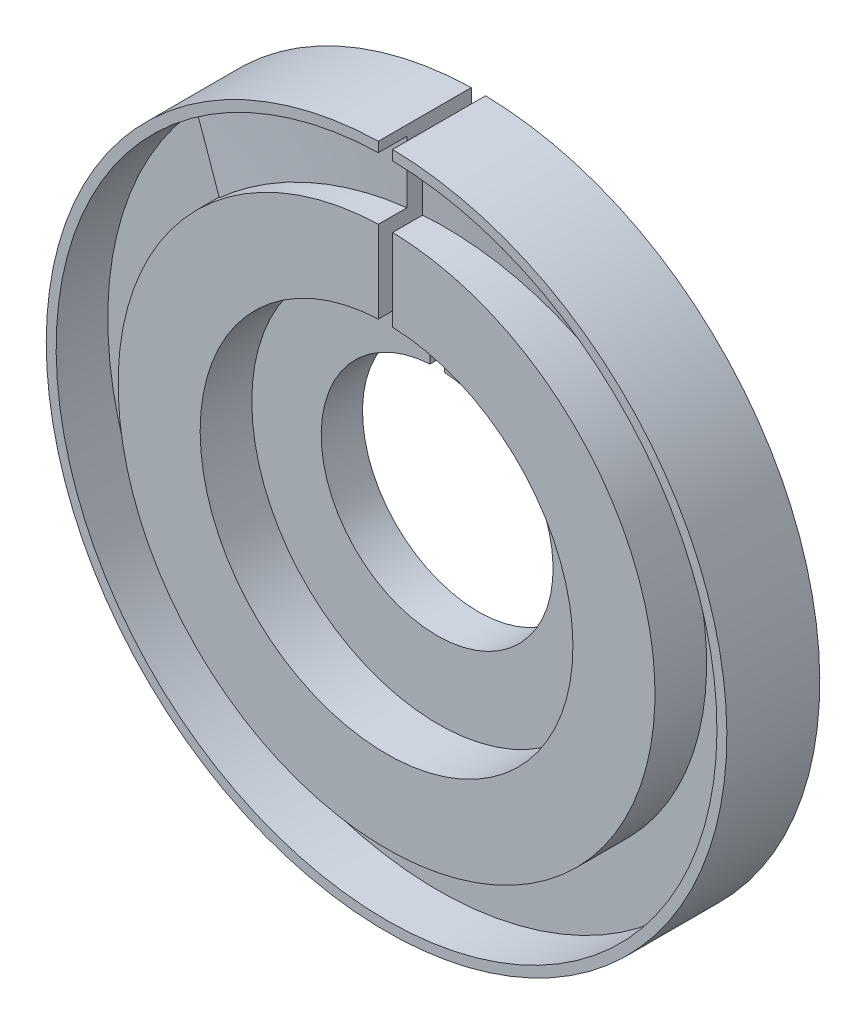
ISO-10303-21;
HEADER;
FILE_DESCRIPTION(('STEP AP214'),'2;1');
FILE_NAME('part.step','',(''),(''),'','','');
FILE_SCHEMA(('AUTOMOTIVE_DESIGN { 1 0 10303 214 1 1 1 1 }'));
ENDSEC;
DATA;
#1=APPLICATION_CONTEXT('core data for automotive mechanical design processes');
#2=APPLICATION_PROTOCOL_DEFINITION('international standard','automotive_design',2000,#1);
#3=PRODUCT_CONTEXT('',#1,'mechanical');
#4=PRODUCT('Part','Part','',(#3));
#5=PRODUCT_RELATED_PRODUCT_CATEGORY('part','',(#4));
#6=PRODUCT_DEFINITION_FORMATION('','',#4);
#7=PRODUCT_DEFINITION_CONTEXT('part definition',#1,'design');
#8=PRODUCT_DEFINITION('design','',#6,#7);
#9=PRODUCT_DEFINITION_SHAPE('','',#8);
#10=(LENGTH_UNIT() NAMED_UNIT(*) SI_UNIT(.MILLI.,.METRE.));
#11=(NAMED_UNIT(*) PLANE_ANGLE_UNIT() SI_UNIT($,.RADIAN.));
#12=(NAMED_UNIT(*) SI_UNIT($,.STERADIAN.) SOLID_ANGLE_UNIT());
#13=UNCERTAINTY_MEASURE_WITH_UNIT(LENGTH_MEASURE(1.E-05),#10,'distance_accuracy_value','');
#14=(GEOMETRIC_REPRESENTATION_CONTEXT(3) GLOBAL_UNCERTAINTY_ASSIGNED_CONTEXT((#13)) GLOBAL_UNIT_ASSIGNED_CONTEXT((#10,
#11,#12)) REPRESENTATION_CONTEXT('',''));
#15=CARTESIAN_POINT('',(0.,0.,0.));
#16=DIRECTION('',(0.,0.,1.));
#17=DIRECTION('',(1.,0.,0.));
#18=AXIS2_PLACEMENT_3D('',#15,#16,#17);
#19=CARTESIAN_POINT('',(0.10824887101548,-0.599294075330642,13.2535439356748));
#20=DIRECTION('',(0.,0.,-1.));
#21=DIRECTION('',(-1.,0.,0.));
#22=AXIS2_PLACEMENT_3D('',#19,#20,#21);
#23=PLANE('',#22);
#24=DIRECTION('',(0.,1.,0.));
#25=VECTOR('',#24,1.);
#26=CARTESIAN_POINT('',(0.75,-0.599294075330642,13.2535439356748));
#27=LINE('',#26,#25);
#28=CARTESIAN_POINT('',(0.75,18.9901968697768,13.2535439356748));
#29=VERTEX_POINT('',#28);
#30=CARTESIAN_POINT('',(0.75,27.6219806648705,13.2535439356748));
#31=VERTEX_POINT('',#30);
#32=EDGE_CURVE('E170',#29,#31,#27,.T.);
#33=ORIENTED_EDGE('',*,*,#32,.F.);
#34=CARTESIAN_POINT('',(0.10824887101548,-0.599294075330642,13.2535439356748));
#35=DIRECTION('',(0.,0.,1.));
#36=DIRECTION('',(1.,0.,0.));
#37=AXIS2_PLACEMENT_3D('',#34,#35,#36);
#38=CIRCLE('',#37,19.6);
#39=CARTESIAN_POINT('',(-0.75,18.9819063188076,13.2535439356748));
#40=VERTEX_POINT('',#39);
#41=EDGE_CURVE('E164',#40,#29,#38,.T.);
#42=ORIENTED_EDGE('',*,*,#41,.F.);
#43=DIRECTION('',(0.,1.,0.));
#44=VECTOR('',#43,1.);
#45=CARTESIAN_POINT('',(-0.75,-0.599294075330642,13.2535439356748));
#46=LINE('',#45,#44);
#47=CARTESIAN_POINT('',(-0.75,27.616226500212,13.2535439356748));
#48=VERTEX_POINT('',#47);
#49=EDGE_CURVE('E146',#40,#48,#46,.T.);
#50=ORIENTED_EDGE('',*,*,#49,.T.);
#51=CARTESIAN_POINT('',(0.10824887101548,-0.599294075330642,13.2535439356748));
#52=DIRECTION('',(0.,0.,1.));
#53=DIRECTION('',(1.,0.,0.));
#54=AXIS2_PLACEMENT_3D('',#51,#52,#53);
#55=CIRCLE('',#54,28.2285705);
#56=EDGE_CURVE('E239',#48,#31,#55,.T.);
#57=ORIENTED_EDGE('',*,*,#56,.T.);
#58=EDGE_LOOP('',(#33,#42,#50,#57));
#59=FACE_BOUND('',#58,.T.);
#60=ADVANCED_FACE('F51',(#59),#23,.F.);
#61=CARTESIAN_POINT('',(0.10824887101548,-0.599294075330642,-57.6537369258378));
#62=DIRECTION('',(0.,0.,1.));
#63=DIRECTION('',(1.,0.,0.));
#64=AXIS2_PLACEMENT_3D('',#61,#62,#63);
#65=CYLINDRICAL_SURFACE('',#64,19.6);
#66=DIRECTION('',(0.,0.,1.));
#67=VECTOR('',#66,1.);
#68=CARTESIAN_POINT('',(0.75,18.9901968697768,-57.6537369258378));
#69=LINE('',#68,#67);
#70=CARTESIAN_POINT('',(0.75,18.9901968697768,7.82497268567483));
#71=VERTEX_POINT('',#70);
#72=EDGE_CURVE('E168',#71,#29,#69,.T.);
#73=ORIENTED_EDGE('',*,*,#72,.F.);
#74=CARTESIAN_POINT('',(0.10824887101548,-0.599294075330642,7.82497268567483));
#75=DIRECTION('',(0.,0.,-1.));
#76=DIRECTION('',(-1.,0.,0.));
#77=AXIS2_PLACEMENT_3D('',#74,#75,#76);
#78=CIRCLE('',#77,19.6);
#79=CARTESIAN_POINT('',(-0.75,18.9819063188076,7.82497268567483));
#80=VERTEX_POINT('',#79);
#81=EDGE_CURVE('E166',#80,#71,#78,.F.);
#82=ORIENTED_EDGE('',*,*,#81,.F.);
#83=DIRECTION('',(0.,0.,1.));
#84=VECTOR('',#83,1.);
#85=CARTESIAN_POINT('',(-0.75,18.9819063188076,-57.6537369258378));
#86=LINE('',#85,#84);
#87=EDGE_CURVE('E150',#40,#80,#86,.F.);
#88=ORIENTED_EDGE('',*,*,#87,.F.);
#89=ORIENTED_EDGE('',*,*,#41,.T.);
#90=EDGE_LOOP('',(#73,#82,#88,#89));
#91=FACE_BOUND('',#90,.T.);
#92=ADVANCED_FACE('F163',(#91),#65,.F.);
#93=CARTESIAN_POINT('',(0.108248871015481,-0.599294075330642,7.82497268567483));
#94=DIRECTION('',(0.,0.,-1.));
#95=DIRECTION('',(-1.,0.,0.));
#96=AXIS2_PLACEMENT_3D('',#93,#94,#95);
#97=PLANE('',#96);
#98=ORIENTED_EDGE('',*,*,#81,.T.);
#99=DIRECTION('',(0.,1.,0.));
#100=VECTOR('',#99,1.);
#101=CARTESIAN_POINT('',(0.75,-0.599294075330642,7.82497268567483));
#102=LINE('',#101,#100);
#103=CARTESIAN_POINT('',(0.75,12.1686928842531,7.82497268567483));
#104=VERTEX_POINT('',#103);
#105=EDGE_CURVE('E306',#104,#71,#102,.T.);
#106=ORIENTED_EDGE('',*,*,#105,.F.);
#107=CARTESIAN_POINT('',(0.,0.,7.82497268567483));
#108=DIRECTION('',(0.,0.,1.));
#109=DIRECTION('',(1.,0.,0.));
#110=AXIS2_PLACEMENT_3D('',#107,#108,#109);
#111=CIRCLE('',#110,12.1917835656344);
#112=CARTESIAN_POINT('',(-0.75,12.1686928842531,7.82497268567483));
#113=VERTEX_POINT('',#112);
#114=EDGE_CURVE('E65',#113,#104,#111,.T.);
#115=ORIENTED_EDGE('',*,*,#114,.F.);
#116=DIRECTION('',(0.,1.,0.));
#117=VECTOR('',#116,1.);
#118=CARTESIAN_POINT('',(-0.75,-0.599294075330642,7.82497268567483));
#119=LINE('',#118,#117);
#120=EDGE_CURVE('E158',#113,#80,#119,.T.);
#121=ORIENTED_EDGE('',*,*,#120,.T.);
#122=EDGE_LOOP('',(#98,#106,#115,#121));
#123=FACE_BOUND('',#122,.T.);
#124=ADVANCED_FACE('F53',(#123),#97,.F.);
#125=CARTESIAN_POINT('',(0.10824887101548,-0.599294075330642,13.2535439356748));
#126=DIRECTION('',(0.,0.,-1.));
#127=DIRECTION('',(-1.,0.,0.));
#128=AXIS2_PLACEMENT_3D('',#125,#126,#127);
#129=CYLINDRICAL_SURFACE('',#128,35.78514168);
#130=CARTESIAN_POINT('',(0.10824887101548,-0.599294075330642,3.48211568567483));
#131=DIRECTION('',(0.,0.,-1.));
#132=DIRECTION('',(-1.,0.,0.));
#133=AXIS2_PLACEMENT_3D('',#130,#131,#132);
#134=CIRCLE('',#133,35.78514168);
#135=CARTESIAN_POINT('',(0.75,35.1800927353194,3.48211568567483));
#136=VERTEX_POINT('',#135);
#137=CARTESIAN_POINT('',(-0.75,35.1755542672281,3.48211568567483));
#138=VERTEX_POINT('',#137);
#139=EDGE_CURVE('E309',#136,#138,#134,.T.);
#140=ORIENTED_EDGE('',*,*,#139,.F.);
#141=DIRECTION('',(0.,0.,-1.));
#142=VECTOR('',#141,1.);
#143=CARTESIAN_POINT('',(0.75,35.1800927353194,25.4821156856748));
#144=LINE('',#143,#142);
#145=CARTESIAN_POINT('',(0.75,35.1800927353194,13.2535439356748));
#146=VERTEX_POINT('',#145);
#147=EDGE_CURVE('E186',#146,#136,#144,.T.);
#148=ORIENTED_EDGE('',*,*,#147,.F.);
#149=CARTESIAN_POINT('',(0.10824887101548,-0.599294075330642,13.2535439356748));
#150=DIRECTION('',(0.,0.,-1.));
#151=DIRECTION('',(-1.,0.,0.));
#152=AXIS2_PLACEMENT_3D('',#149,#150,#151);
#153=CIRCLE('',#152,35.78514168);
#154=CARTESIAN_POINT('',(-0.75,35.1755542672281,13.2535439356748));
#155=VERTEX_POINT('',#154);
#156=EDGE_CURVE('E311',#146,#155,#153,.T.);
#157=ORIENTED_EDGE('',*,*,#156,.T.);
#158=DIRECTION('',(0.,0.,-1.));
#159=VECTOR('',#158,1.);
#160=CARTESIAN_POINT('',(-0.75,35.1755542672281,25.4821156856748));
#161=LINE('',#160,#159);
#162=EDGE_CURVE('E185',#155,#138,#161,.T.);
#163=ORIENTED_EDGE('',*,*,#162,.T.);
#164=EDGE_LOOP('',(#140,#148,#157,#163));
#165=FACE_BOUND('',#164,.T.);
#166=ADVANCED_FACE('F220',(#165),#129,.T.);
#167=CARTESIAN_POINT('',(0.10824887101548,-0.599294075330642,13.2535439356748));
#168=DIRECTION('',(0.,0.,1.));
#169=DIRECTION('',(1.,0.,0.));
#170=AXIS2_PLACEMENT_3D('',#167,#168,#169);
#171=PLANE('',#170);
#172=ORIENTED_EDGE('',*,*,#156,.F.);
#173=DIRECTION('',(0.,-1.,0.));
#174=VECTOR('',#173,1.);
#175=CARTESIAN_POINT('',(0.75,-0.599294075330642,13.2535439356748));
#176=LINE('',#175,#174);
#177=CARTESIAN_POINT('',(0.75,34.1376343802076,13.2535439356748));
#178=VERTEX_POINT('',#177);
#179=EDGE_CURVE('E296',#146,#178,#176,.T.);
#180=ORIENTED_EDGE('',*,*,#179,.T.);
#181=CARTESIAN_POINT('',(0.10824887101548,-0.599294075330642,13.2535439356748));
#182=DIRECTION('',(0.,0.,1.));
#183=DIRECTION('',(1.,0.,0.));
#184=AXIS2_PLACEMENT_3D('',#181,#182,#183);
#185=CIRCLE('',#184,34.742856);
#186=CARTESIAN_POINT('',(-0.75,34.1329596942153,13.2535439356748));
#187=VERTEX_POINT('',#186);
#188=EDGE_CURVE('E271',#187,#178,#185,.T.);
#189=ORIENTED_EDGE('',*,*,#188,.F.);
#190=DIRECTION('',(0.,-1.,0.));
#191=VECTOR('',#190,1.);
#192=CARTESIAN_POINT('',(-0.75,-0.599294075330642,13.2535439356748));
#193=LINE('',#192,#191);
#194=EDGE_CURVE('E159',#155,#187,#193,.T.);
#195=ORIENTED_EDGE('',*,*,#194,.F.);
#196=EDGE_LOOP('',(#172,#180,#189,#195));
#197=FACE_BOUND('',#196,.T.);
#198=ADVANCED_FACE('F222',(#197),#171,.T.);
#199=CARTESIAN_POINT('',(0.10824887101548,-0.599294075330642,102.282112435675));
#200=DIRECTION('',(0.,0.,1.));
#201=DIRECTION('',(1.,0.,0.));
#202=AXIS2_PLACEMENT_3D('',#199,#200,#201);
#203=CYLINDRICAL_SURFACE('',#202,28.2285705);
#204=DIRECTION('',(0.,0.,1.));
#205=VECTOR('',#204,1.);
#206=CARTESIAN_POINT('',(0.75,27.6219806648705,102.282112435675));
#207=LINE('',#206,#205);
#208=CARTESIAN_POINT('',(0.749999999999999,27.6219806648705,10.1087082779547));
#209=VERTEX_POINT('',#208);
#210=EDGE_CURVE('E293',#31,#209,#207,.F.);
#211=ORIENTED_EDGE('',*,*,#210,.F.);
#212=ORIENTED_EDGE('',*,*,#56,.F.);
#213=DIRECTION('',(0.,0.,1.));
#214=VECTOR('',#213,1.);
#215=CARTESIAN_POINT('',(-0.75,27.616226500212,102.282112435675));
#216=LINE('',#215,#214);
#217=CARTESIAN_POINT('',(-0.750000000000001,27.616226500212,10.2545026190406));
#218=VERTEX_POINT('',#217);
#219=EDGE_CURVE('E153',#48,#218,#216,.F.);
#220=ORIENTED_EDGE('',*,*,#219,.T.);
#221=CARTESIAN_POINT('',(21.2796767460156,18.0721502771328,7.82497268567483));
#222=CARTESIAN_POINT('',(17.0180414151269,22.9043905331233,8.44538082853197));
#223=CARTESIAN_POINT('',(11.0818101850597,25.4090342938741,9.06578897138911));
#224=CARTESIAN_POINT('',(5.14557895499255,27.9136780546249,9.68619711424625));
#225=CARTESIAN_POINT('',(-1.2895047760401,27.5946499058795,10.3066052571034));
#226=CARTESIAN_POINT('',(-7.72458850707275,27.275621757134,10.9270133999605));
#227=CARTESIAN_POINT('',(-13.3839774850171,24.1961091363748,11.5474215428177));
#228=CARTESIAN_POINT('',(-16.1777484608214,22.6759003270794,11.8536875141835));
#229=CARTESIAN_POINT('',(-18.5631954813347,20.5721337997694,12.1678296856599));
#230=(BOUNDED_CURVE() B_SPLINE_CURVE(2,(#221,#222,#223,#224,#225,#226,#227,#228,#229),
.UNSPECIFIED.,.F.,.F.) B_SPLINE_CURVE_WITH_KNOTS((3,2,2,2,3),(0.,0.0714285714285714,
0.142857142857143,0.214285714285714,0.249999999999151),
.UNSPECIFIED.) CURVE() GEOMETRIC_REPRESENTATION_ITEM() RATIONAL_B_SPLINE_CURVE((1.,
0.974927912181824,1.,0.974927912181824,1.,0.974927912181824,1.,0.98746395609121,0.987463956090912)) REPRESENTATION_ITEM(''));
#231=CARTESIAN_POINT('',(-18.5631954813346,20.5721337997694,12.1678296856599));
#232=VERTEX_POINT('',#231);
#233=EDGE_CURVE('E261',#232,#218,#230,.F.);
#234=ORIENTED_EDGE('',*,*,#233,.F.);
#235=DIRECTION('',(0.,0.,1.));
#236=VECTOR('',#235,1.);
#237=CARTESIAN_POINT('',(-18.5631954807675,20.5721338002695,102.282112435675));
#238=LINE('',#237,#236);
#239=CARTESIAN_POINT('',(-18.5631954814446,20.5721337996724,7.82497268567483));
#240=VERTEX_POINT('',#239);
#241=EDGE_CURVE('E268',#240,#232,#238,.T.);
#242=ORIENTED_EDGE('',*,*,#241,.F.);
#243=CARTESIAN_POINT('',(0.10824887101548,-0.599294075330642,7.82497268567483));
#244=DIRECTION('',(0.,0.,1.));
#245=DIRECTION('',(1.,0.,0.));
#246=AXIS2_PLACEMENT_3D('',#243,#244,#245);
#247=CIRCLE('',#246,28.2285705);
#248=CARTESIAN_POINT('',(21.2796767460156,18.0721502771328,7.82497268567483));
#249=VERTEX_POINT('',#248);
#250=EDGE_CURVE('E291',#240,#249,#247,.T.);
#251=ORIENTED_EDGE('',*,*,#250,.T.);
#252=EDGE_CURVE('E240',#209,#249,#230,.F.);
#253=ORIENTED_EDGE('',*,*,#252,.F.);
#254=EDGE_LOOP('',(#211,#212,#220,#234,#242,#251,#253));
#255=FACE_BOUND('',#254,.T.);
#256=ADVANCED_FACE('F266',(#255),#203,.T.);
#257=CARTESIAN_POINT('',(0.10824887101548,-0.599294075330642,102.282112435675));
#258=DIRECTION('',(0.,0.,1.));
#259=DIRECTION('',(1.,0.,0.));
#260=AXIS2_PLACEMENT_3D('',#257,#258,#259);
#261=CYLINDRICAL_SURFACE('',#260,34.742856);
#262=ORIENTED_EDGE('',*,*,#188,.T.);
#263=DIRECTION('',(0.,0.,1.));
#264=VECTOR('',#263,1.);
#265=CARTESIAN_POINT('',(0.75,34.1376343802076,102.282112435675));
#266=LINE('',#265,#264);
#267=CARTESIAN_POINT('',(0.750000000000002,34.1376343802076,10.1204542776792));
#268=VERTEX_POINT('',#267);
#269=EDGE_CURVE('E297',#178,#268,#266,.F.);
#270=ORIENTED_EDGE('',*,*,#269,.T.);
#271=CARTESIAN_POINT('',(26.1653908710156,22.3809451277013,7.82497268567483));
#272=CARTESIAN_POINT('',(20.9203012329988,28.3283177504589,8.44538082853197));
#273=CARTESIAN_POINT('',(13.6141704883007,31.4109562252291,9.06578897138911));
#274=CARTESIAN_POINT('',(6.30803974360264,34.4935946999993,9.68619711424626));
#275=CARTESIAN_POINT('',(-1.612063309976,34.1009446707741,10.3066052571034));
#276=CARTESIAN_POINT('',(-9.53216636355465,33.7082946415489,10.9270133999605));
#277=CARTESIAN_POINT('',(-16.4975681825631,29.9181252621529,11.5474215428177));
#278=CARTESIAN_POINT('',(-19.9360555373991,28.0470990353279,11.8536875141835));
#279=CARTESIAN_POINT('',(-22.871990331877,25.4578479247925,12.1678296856599));
#280=(BOUNDED_CURVE() B_SPLINE_CURVE(2,(#271,#272,#273,#274,#275,#276,#277,#278,#279),
.UNSPECIFIED.,.F.,.F.) B_SPLINE_CURVE_WITH_KNOTS((3,2,2,2,3),(0.,0.0714285714285714,
0.142857142857143,0.214285714285714,0.249999999999151),
.UNSPECIFIED.) CURVE() GEOMETRIC_REPRESENTATION_ITEM() RATIONAL_B_SPLINE_CURVE((1.,
0.974927912181824,1.,0.974927912181824,1.,0.974927912181824,1.,0.98746395609121,0.987463956090912)) REPRESENTATION_ITEM(''));
#281=CARTESIAN_POINT('',(26.1653908710156,22.3809451277013,7.82497268567483));
#282=VERTEX_POINT('',#281);
#283=EDGE_CURVE('E236',#268,#282,#280,.F.);
#284=ORIENTED_EDGE('',*,*,#283,.T.);
#285=CARTESIAN_POINT('',(0.10824887101548,-0.599294075330642,7.82497268567483));
#286=DIRECTION('',(0.,0.,1.));
#287=DIRECTION('',(1.,0.,0.));
#288=AXIS2_PLACEMENT_3D('',#285,#286,#287);
#289=CIRCLE('',#288,34.742856);
#290=CARTESIAN_POINT('',(-21.0630309720428,26.9478101798111,7.82497268567483));
#291=VERTEX_POINT('',#290);
#292=EDGE_CURVE('E289',#291,#282,#289,.T.);
#293=ORIENTED_EDGE('',*,*,#292,.F.);
#294=DIRECTION('',(0.,0.,1.));
#295=VECTOR('',#294,1.);
#296=CARTESIAN_POINT('',(-21.0630309720428,26.9478101798111,0.1298468018093));
#297=LINE('',#296,#295);
#298=CARTESIAN_POINT('',(-21.0630309720428,26.9478101798111,11.9798668792234));
#299=VERTEX_POINT('',#298);
#300=EDGE_CURVE('E316',#291,#299,#297,.T.);
#301=ORIENTED_EDGE('',*,*,#300,.T.);
#302=CARTESIAN_POINT('',(-0.75,34.1329596942153,10.2389272507116));
#303=VERTEX_POINT('',#302);
#304=EDGE_CURVE('E238',#299,#303,#280,.F.);
#305=ORIENTED_EDGE('',*,*,#304,.T.);
#306=DIRECTION('',(0.,0.,1.));
#307=VECTOR('',#306,1.);
#308=CARTESIAN_POINT('',(-0.75,34.1329596942153,102.282112435675));
#309=LINE('',#308,#307);
#310=EDGE_CURVE('E199',#187,#303,#309,.F.);
#311=ORIENTED_EDGE('',*,*,#310,.F.);
#312=EDGE_LOOP('',(#262,#270,#284,#293,#301,#305,#311));
#313=FACE_BOUND('',#312,.T.);
#314=ADVANCED_FACE('F331',(#313),#261,.F.);
#315=CARTESIAN_POINT('',(26.2043338209394,22.4152895813072,7.82497268567483));
#316=CARTESIAN_POINT('',(20.9514052855056,28.3715506782583,8.44538082853197));
#317=CARTESIAN_POINT('',(13.6343553738579,31.4587962214383,9.06578897138911));
#318=CARTESIAN_POINT('',(6.31730546221019,34.5460417646182,9.68619711424625));
#319=CARTESIAN_POINT('',(-1.61463435292145,34.1528049116184,10.3066052571034));
#320=CARTESIAN_POINT('',(-9.5465741680531,33.7595680586185,10.9270133999605));
#321=CARTESIAN_POINT('',(-16.522385927424,29.9637341909089,11.5474215428177));
#322=CARTESIAN_POINT('',(-19.9660121743485,28.0899116758088,11.8536875141835));
#323=CARTESIAN_POINT('',(-22.9063347854826,25.4967908747164,12.1678296856599));
#324=CARTESIAN_POINT('',(20.9310015830907,17.7646476873181,7.82497268567483));
#325=CARTESIAN_POINT('',(16.7395517116854,22.5173051126891,8.44538082853197));
#326=CARTESIAN_POINT('',(10.9010850917108,24.9806995502245,9.06578897138911));
#327=CARTESIAN_POINT('',(5.0626184717362,27.4440939877598,9.68619711424625));
#328=CARTESIAN_POINT('',(-1.2664849786276,27.1303199575555,10.3066052571034));
#329=CARTESIAN_POINT('',(-7.59558842899139,26.8165459273512,10.9270133999605));
#330=CARTESIAN_POINT('',(-13.1617721500399,23.7877502242752,11.5474215428177));
#331=CARTESIAN_POINT('',(-15.9095321266847,22.2925779433326,11.8536875141835));
#332=CARTESIAN_POINT('',(-18.2556928915218,20.2234586368429,12.1678296856599));
#333=(BOUNDED_SURFACE() B_SPLINE_SURFACE(1,2,((#315,#316,#317,#318,#319,#320,#321,#322,#323),
(#324,#325,#326,#327,#328,#329,#330,#331,#332)),.UNSPECIFIED.,.F.,.F.,
.F.) B_SPLINE_SURFACE_WITH_KNOTS((2,2),(3,2,2,2,3),(0.,1.),(0.,0.0714285714285714,
0.142857142857143,0.214285714285714,0.249999999999151),
.UNSPECIFIED.) GEOMETRIC_REPRESENTATION_ITEM() RATIONAL_B_SPLINE_SURFACE(((1.,0.974927912181824,
1.,0.974927912181824,1.,0.974927912181824,1.,0.98746395609121,0.987463956090912),(1.,
0.974927912181824,1.,0.974927912181824,1.,0.974927912181824,1.,0.98746395609121,0.987463956090912))) REPRESENTATION_ITEM('') SURFACE());
#334=CARTESIAN_POINT('',(0.749999999999999,27.6219806648705,10.1087082779547));
#335=CARTESIAN_POINT('',(0.749999999999999,28.2229731783562,10.1100404599749));
#336=CARTESIAN_POINT('',(0.749999999999999,28.8239658652449,10.1112904612349));
#337=CARTESIAN_POINT('',(0.749999999999999,30.0259515171998,10.113648263325));
#338=CARTESIAN_POINT('',(0.75,30.6269444822661,10.1147560641555));
#339=CARTESIAN_POINT('',(0.75,32.1978362656896,10.1174947826194));
#340=CARTESIAN_POINT('',(0.75,33.1677352547746,10.1190294024873));
#341=CARTESIAN_POINT('',(0.749999999999998,34.1376343802076,10.1204542776792));
#342=B_SPLINE_CURVE_WITH_KNOTS('',3,(#334,#335,#336,#337,#338,#339,#340,#341),.UNSPECIFIED.,.F.,
.F.,(4,2,2,4),(0.,1.80298195005125,3.60596389519733,6.51566443794463),.UNSPECIFIED.);
#343=EDGE_CURVE('E301',#209,#268,#342,.T.);
#344=DIRECTION('',(-0.750000000000002,-0.661437827766145,0.));
#345=VECTOR('',#344,1.);
#346=CARTESIAN_POINT('',(23.567667702015,20.0899686343127,7.82497268567483));
#347=LINE('',#346,#345);
#348=EDGE_CURVE('E273',#282,#249,#347,.T.);
#349=ORIENTED_EDGE('',*,*,#343,.F.);
#350=ORIENTED_EDGE('',*,*,#252,.T.);
#351=ORIENTED_EDGE('',*,*,#348,.F.);
#352=ORIENTED_EDGE('',*,*,#283,.F.);
#353=EDGE_LOOP('',(#349,#350,#351,#352));
#354=FACE_BOUND('',#353,.T.);
#355=ADVANCED_FACE('F219',(#354),#333,.F.);
#356=CARTESIAN_POINT('',(0.10824887101548,-0.599294075330642,3.48211568567483));
#357=DIRECTION('',(0.,0.,-1.));
#358=DIRECTION('',(-1.,0.,0.));
#359=AXIS2_PLACEMENT_3D('',#356,#357,#358);
#360=PLANE('',#359);
#361=CARTESIAN_POINT('',(0.,0.,3.48211568567483));
#362=DIRECTION('',(0.,0.,-1.));
#363=DIRECTION('',(-1.,0.,0.));
#364=AXIS2_PLACEMENT_3D('',#361,#362,#363);
#365=CIRCLE('',#364,12.1917835656344);
#366=CARTESIAN_POINT('',(0.75,12.1686928842531,3.48211568567482));
#367=VERTEX_POINT('',#366);
#368=CARTESIAN_POINT('',(-0.75,12.1686928842531,3.48211568567483));
#369=VERTEX_POINT('',#368);
#370=EDGE_CURVE('E177',#367,#369,#365,.T.);
#371=ORIENTED_EDGE('',*,*,#370,.F.);
#372=DIRECTION('',(0.,1.,0.));
#373=VECTOR('',#372,1.);
#374=CARTESIAN_POINT('',(0.75,0.,3.48211568567483));
#375=LINE('',#374,#373);
#376=EDGE_CURVE('E73',#367,#136,#375,.T.);
#377=ORIENTED_EDGE('',*,*,#376,.T.);
#378=ORIENTED_EDGE('',*,*,#139,.T.);
#379=DIRECTION('',(0.,1.,0.));
#380=VECTOR('',#379,1.);
#381=CARTESIAN_POINT('',(-0.75,0.,3.48211568567483));
#382=LINE('',#381,#380);
#383=EDGE_CURVE('E182',#369,#138,#382,.T.);
#384=ORIENTED_EDGE('',*,*,#383,.F.);
#385=EDGE_LOOP('',(#371,#377,#378,#384));
#386=FACE_BOUND('',#385,.T.);
#387=ADVANCED_FACE('F215',(#386),#360,.T.);
#388=CARTESIAN_POINT('',(0.10824887101548,-0.599294075330642,7.82497268567483));
#389=DIRECTION('',(0.,0.,-1.));
#390=DIRECTION('',(-1.,0.,0.));
#391=AXIS2_PLACEMENT_3D('',#388,#389,#390);
#392=PLANE('',#391);
#393=ORIENTED_EDGE('',*,*,#250,.F.);
#394=DIRECTION('',(-0.365033138366987,0.930994526242742,0.));
#395=VECTOR('',#394,1.);
#396=CARTESIAN_POINT('',(-18.5631954814446,20.5721337996724,7.82497268567483));
#397=LINE('',#396,#395);
#398=EDGE_CURVE('E314',#240,#291,#397,.T.);
#399=ORIENTED_EDGE('',*,*,#398,.T.);
#400=ORIENTED_EDGE('',*,*,#292,.T.);
#401=ORIENTED_EDGE('',*,*,#348,.T.);
#402=EDGE_LOOP('',(#393,#399,#400,#401));
#403=FACE_BOUND('',#402,.T.);
#404=ADVANCED_FACE('F218',(#403),#392,.F.);
#405=CARTESIAN_POINT('',(-0.750000000000001,27.616226500212,10.2545026190406));
#406=CARTESIAN_POINT('',(-0.749999999999999,28.2172179084182,10.2527380157513));
#407=CARTESIAN_POINT('',(-0.75,28.8182096195251,10.2510817474913));
#408=CARTESIAN_POINT('',(-0.750000000000001,30.020193528063,10.2479567758319));
#409=CARTESIAN_POINT('',(-0.750000000000003,30.6211857254939,10.2464880724317));
#410=CARTESIAN_POINT('',(-0.750000000000006,32.1924382338831,10.2428553910496));
#411=CARTESIAN_POINT('',(-0.750000000000007,33.1626988440348,10.2408186866022));
#412=CARTESIAN_POINT('',(-0.750000000000001,34.1329596942153,10.2389272507116));
#413=B_SPLINE_CURVE_WITH_KNOTS('',3,(#405,#406,#407,#408,#409,#410,#411,#412),.UNSPECIFIED.,.F.,
.F.,(4,2,2,4),(0.,1.80298196189264,3.60596391529701,6.51675204247712),.UNSPECIFIED.);
#414=EDGE_CURVE('E188',#218,#303,#413,.T.);
#415=CARTESIAN_POINT('',(-21.0630309720428,26.9478101798111,11.9798668792234));
#416=CARTESIAN_POINT('',(-20.8546857867409,26.4164386228164,11.9925718061449));
#417=CARTESIAN_POINT('',(-20.6463452664042,25.8850789635428,12.0058722800938));
#418=CARTESIAN_POINT('',(-20.2296784794084,24.8223959981222,12.0338719451913));
#419=CARTESIAN_POINT('',(-20.021352212647,24.2910726917142,12.0485711249443));
#420=CARTESIAN_POINT('',(-19.6047091588106,23.2284502562246,12.0795764940828));
#421=CARTESIAN_POINT('',(-19.3963923722131,22.697151128361,12.0958827320777));
#422=CARTESIAN_POINT('',(-18.9797779114594,21.6346016178556,12.1303765609862));
#423=CARTESIAN_POINT('',(-18.7714802374727,21.1033512356463,12.1485641672258));
#424=CARTESIAN_POINT('',(-18.5631954813505,20.5721337997873,12.1678296856599));
#425=B_SPLINE_CURVE_WITH_KNOTS('',3,(#415,#416,#417,#418,#419,#420,#421,#422,#423,#424),
.UNSPECIFIED.,.F.,.F.,(4,2,2,2,4),(0.,1.71269525254429,3.42537655255304,5.13810967283557,
6.85085674647253),.UNSPECIFIED.);
#426=EDGE_CURVE('E59',#299,#232,#425,.T.);
#427=ORIENTED_EDGE('',*,*,#233,.T.);
#428=ORIENTED_EDGE('',*,*,#414,.T.);
#429=ORIENTED_EDGE('',*,*,#304,.F.);
#430=ORIENTED_EDGE('',*,*,#426,.T.);
#431=EDGE_LOOP('',(#427,#428,#429,#430));
#432=FACE_BOUND('',#431,.T.);
#433=ADVANCED_FACE('F201',(#432),#333,.F.);
#434=CARTESIAN_POINT('',(-18.5631954814446,20.5721337996724,0.1298468018093));
#435=DIRECTION('',(0.930994526242742,0.365033138366987,0.));
#436=DIRECTION('',(-0.365033138366987,0.930994526242742,0.));
#437=AXIS2_PLACEMENT_3D('',#434,#435,#436);
#438=PLANE('',#437);
#439=ORIENTED_EDGE('',*,*,#300,.F.);
#440=ORIENTED_EDGE('',*,*,#398,.F.);
#441=ORIENTED_EDGE('',*,*,#241,.T.);
#442=ORIENTED_EDGE('',*,*,#426,.F.);
#443=EDGE_LOOP('',(#439,#440,#441,#442));
#444=FACE_BOUND('',#443,.T.);
#445=ADVANCED_FACE('F212',(#444),#438,.F.);
#446=CARTESIAN_POINT('',(-0.75,0.,25.4821156856748));
#447=DIRECTION('',(-1.,0.,0.));
#448=DIRECTION('',(0.,0.,1.));
#449=AXIS2_PLACEMENT_3D('',#446,#447,#448);
#450=PLANE('',#449);
#451=ORIENTED_EDGE('',*,*,#49,.F.);
#452=ORIENTED_EDGE('',*,*,#87,.T.);
#453=ORIENTED_EDGE('',*,*,#120,.F.);
#454=DIRECTION('',(0.,0.,1.));
#455=VECTOR('',#454,1.);
#456=CARTESIAN_POINT('',(-0.75,12.1686928842531,-9.17502731432518));
#457=LINE('',#456,#455);
#458=EDGE_CURVE('E179',#113,#369,#457,.F.);
#459=ORIENTED_EDGE('',*,*,#458,.T.);
#460=ORIENTED_EDGE('',*,*,#383,.T.);
#461=ORIENTED_EDGE('',*,*,#162,.F.);
#462=ORIENTED_EDGE('',*,*,#194,.T.);
#463=ORIENTED_EDGE('',*,*,#310,.T.);
#464=ORIENTED_EDGE('',*,*,#414,.F.);
#465=ORIENTED_EDGE('',*,*,#219,.F.);
#466=EDGE_LOOP('',(#451,#452,#453,#459,#460,#461,#462,#463,#464,#465));
#467=FACE_BOUND('',#466,.T.);
#468=ADVANCED_FACE('F148',(#467),#450,.F.);
#469=CARTESIAN_POINT('',(0.75,0.,25.4821156856748));
#470=DIRECTION('',(-1.,0.,0.));
#471=DIRECTION('',(0.,0.,1.));
#472=AXIS2_PLACEMENT_3D('',#469,#470,#471);
#473=PLANE('',#472);
#474=ORIENTED_EDGE('',*,*,#269,.F.);
#475=ORIENTED_EDGE('',*,*,#179,.F.);
#476=ORIENTED_EDGE('',*,*,#147,.T.);
#477=ORIENTED_EDGE('',*,*,#376,.F.);
#478=DIRECTION('',(0.,0.,1.));
#479=VECTOR('',#478,1.);
#480=CARTESIAN_POINT('',(0.75,12.1686928842531,-9.17502731432518));
#481=LINE('',#480,#479);
#482=EDGE_CURVE('E12',#104,#367,#481,.F.);
#483=ORIENTED_EDGE('',*,*,#482,.F.);
#484=ORIENTED_EDGE('',*,*,#105,.T.);
#485=ORIENTED_EDGE('',*,*,#72,.T.);
#486=ORIENTED_EDGE('',*,*,#32,.T.);
#487=ORIENTED_EDGE('',*,*,#210,.T.);
#488=ORIENTED_EDGE('',*,*,#343,.T.);
#489=EDGE_LOOP('',(#474,#475,#476,#477,#483,#484,#485,#486,#487,#488));
#490=FACE_BOUND('',#489,.T.);
#491=ADVANCED_FACE('F211',(#490),#473,.T.);
#492=CARTESIAN_POINT('',(0.,0.,-9.17502731432518));
#493=DIRECTION('',(0.,0.,1.));
#494=DIRECTION('',(1.,0.,0.));
#495=AXIS2_PLACEMENT_3D('',#492,#493,#494);
#496=CYLINDRICAL_SURFACE('',#495,12.1917835656344);
#497=ORIENTED_EDGE('',*,*,#114,.T.);
#498=ORIENTED_EDGE('',*,*,#482,.T.);
#499=ORIENTED_EDGE('',*,*,#370,.T.);
#500=ORIENTED_EDGE('',*,*,#458,.F.);
#501=EDGE_LOOP('',(#497,#498,#499,#500));
#502=FACE_BOUND('',#501,.T.);
#503=ADVANCED_FACE('F336',(#502),#496,.F.);
#504=CLOSED_SHELL('',(#60,#92,#124,#166,#198,#256,#314,#355,#387,#404,#433,#445,#468,#491,#503));
#505=MANIFOLD_SOLID_BREP('B2',#504);
#506=ADVANCED_BREP_SHAPE_REPRESENTATION('',(#18,#505),#14);
#507=SHAPE_DEFINITION_REPRESENTATION(#9,#506);
ENDSEC;
END-ISO-10303-21;
